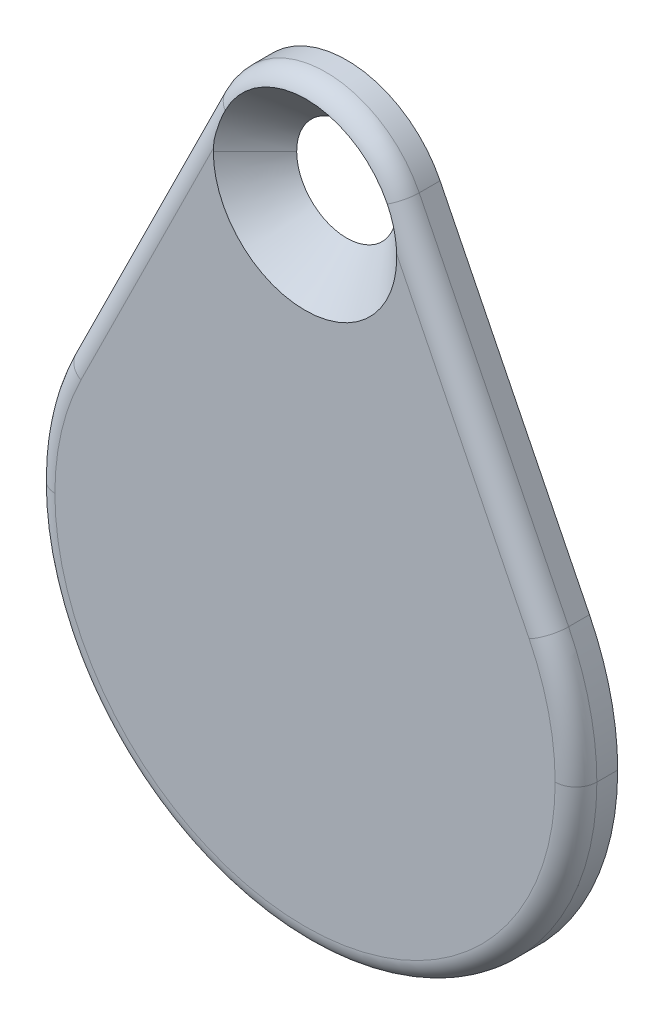
ISO-10303-21;
HEADER;
FILE_DESCRIPTION(('STEP AP214'),'2;1');
FILE_NAME('part.step','',(''),(''),'','','');
FILE_SCHEMA(('AUTOMOTIVE_DESIGN { 1 0 10303 214 1 1 1 1 }'));
ENDSEC;
DATA;
#1=APPLICATION_CONTEXT('core data for automotive mechanical design processes');
#2=APPLICATION_PROTOCOL_DEFINITION('international standard','automotive_design',2000,#1);
#3=PRODUCT_CONTEXT('',#1,'mechanical');
#4=PRODUCT('Part','Part','',(#3));
#5=PRODUCT_RELATED_PRODUCT_CATEGORY('part','',(#4));
#6=PRODUCT_DEFINITION_FORMATION('','',#4);
#7=PRODUCT_DEFINITION_CONTEXT('part definition',#1,'design');
#8=PRODUCT_DEFINITION('design','',#6,#7);
#9=PRODUCT_DEFINITION_SHAPE('','',#8);
#10=(LENGTH_UNIT() NAMED_UNIT(*) SI_UNIT(.MILLI.,.METRE.));
#11=(NAMED_UNIT(*) PLANE_ANGLE_UNIT() SI_UNIT($,.RADIAN.));
#12=(NAMED_UNIT(*) SI_UNIT($,.STERADIAN.) SOLID_ANGLE_UNIT());
#13=UNCERTAINTY_MEASURE_WITH_UNIT(LENGTH_MEASURE(1.E-05),#10,'distance_accuracy_value','');
#14=(GEOMETRIC_REPRESENTATION_CONTEXT(3) GLOBAL_UNCERTAINTY_ASSIGNED_CONTEXT((#13)) GLOBAL_UNIT_ASSIGNED_CONTEXT((#10,
#11,#12)) REPRESENTATION_CONTEXT('',''));
#15=CARTESIAN_POINT('',(0.,0.,0.));
#16=DIRECTION('',(0.,0.,1.));
#17=DIRECTION('',(1.,0.,0.));
#18=AXIS2_PLACEMENT_3D('',#15,#16,#17);
#19=CARTESIAN_POINT('',(0.,9.,1.));
#20=DIRECTION('',(0.,0.,1.));
#21=DIRECTION('',(1.,0.,0.));
#22=AXIS2_PLACEMENT_3D('',#19,#20,#21);
#23=CONICAL_SURFACE('',#22,2.2,0.785398163397448);
#24=CARTESIAN_POINT('',(0.,9.,0.));
#25=DIRECTION('',(0.,0.,1.));
#26=DIRECTION('',(1.,0.,0.));
#27=AXIS2_PLACEMENT_3D('',#24,#25,#26);
#28=CIRCLE('',#27,1.2);
#29=CARTESIAN_POINT('',(-1.2,9.,0.));
#30=VERTEX_POINT('',#29);
#31=CARTESIAN_POINT('',(1.2,9.,0.));
#32=VERTEX_POINT('',#31);
#33=EDGE_CURVE('E39',#30,#32,#28,.T.);
#34=ORIENTED_EDGE('',*,*,#33,.F.);
#35=DIRECTION('',(-0.707106781186547,0.,0.707106781186548));
#36=VECTOR('',#35,1.);
#37=CARTESIAN_POINT('',(-2.2,9.,1.));
#38=LINE('',#37,#36);
#39=CARTESIAN_POINT('',(-2.2,9.,1.));
#40=VERTEX_POINT('',#39);
#41=EDGE_CURVE('E11',#30,#40,#38,.T.);
#42=ORIENTED_EDGE('',*,*,#41,.T.);
#43=CARTESIAN_POINT('',(0.,9.,1.));
#44=DIRECTION('',(0.,0.,1.));
#45=DIRECTION('',(1.,0.,0.));
#46=AXIS2_PLACEMENT_3D('',#43,#44,#45);
#47=CIRCLE('',#46,2.2);
#48=CARTESIAN_POINT('',(2.2,9.,1.));
#49=VERTEX_POINT('',#48);
#50=EDGE_CURVE('E26',#40,#49,#47,.T.);
#51=ORIENTED_EDGE('',*,*,#50,.T.);
#52=DIRECTION('',(0.707106781186547,0.,0.707106781186548));
#53=VECTOR('',#52,1.);
#54=CARTESIAN_POINT('',(2.2,9.,1.));
#55=LINE('',#54,#53);
#56=EDGE_CURVE('E156',#32,#49,#55,.T.);
#57=ORIENTED_EDGE('',*,*,#56,.F.);
#58=EDGE_LOOP('',(#34,#42,#51,#57));
#59=FACE_BOUND('',#58,.T.);
#60=ADVANCED_FACE('F16',(#59),#23,.F.);
#61=CARTESIAN_POINT('',(0.,0.,0.5));
#62=DIRECTION('',(0.,0.,1.));
#63=DIRECTION('',(1.,0.,0.));
#64=AXIS2_PLACEMENT_3D('',#61,#62,#63);
#65=TOROIDAL_SURFACE('',#64,6.,0.5);
#66=CARTESIAN_POINT('',(0.,0.,0.5));
#67=DIRECTION('',(0.,0.,-1.));
#68=DIRECTION('',(1.,0.,0.));
#69=AXIS2_PLACEMENT_3D('',#66,#67,#68);
#70=CIRCLE('',#69,6.5);
#71=CARTESIAN_POINT('',(-6.5,0.,0.5));
#72=VERTEX_POINT('',#71);
#73=CARTESIAN_POINT('',(-5.82274170710451,2.88888888888889,0.5));
#74=VERTEX_POINT('',#73);
#75=EDGE_CURVE('E271',#72,#74,#70,.T.);
#76=ORIENTED_EDGE('',*,*,#75,.F.);
#77=CARTESIAN_POINT('',(-6.,0.,0.5));
#78=DIRECTION('',(0.,1.,0.));
#79=DIRECTION('',(-1.,0.,0.));
#80=AXIS2_PLACEMENT_3D('',#77,#78,#79);
#81=CIRCLE('',#80,0.5);
#82=CARTESIAN_POINT('',(-6.,0.,1.));
#83=VERTEX_POINT('',#82);
#84=EDGE_CURVE('E257',#72,#83,#81,.T.);
#85=ORIENTED_EDGE('',*,*,#84,.T.);
#86=CARTESIAN_POINT('',(0.,0.,1.));
#87=DIRECTION('',(0.,0.,1.));
#88=DIRECTION('',(1.,0.,0.));
#89=AXIS2_PLACEMENT_3D('',#86,#87,#88);
#90=CIRCLE('',#89,6.);
#91=CARTESIAN_POINT('',(-5.3748384988657,2.66666666666666,1.));
#92=VERTEX_POINT('',#91);
#93=EDGE_CURVE('E234',#92,#83,#90,.T.);
#94=ORIENTED_EDGE('',*,*,#93,.F.);
#95=CARTESIAN_POINT('',(-5.3748384988657,2.66666666666666,0.5));
#96=DIRECTION('',(-0.444444444444444,-0.895806416477617,0.));
#97=DIRECTION('',(0.895806416477617,-0.444444444444444,0.));
#98=AXIS2_PLACEMENT_3D('',#95,#96,#97);
#99=CIRCLE('',#98,0.5);
#100=EDGE_CURVE('E259',#92,#74,#99,.T.);
#101=ORIENTED_EDGE('',*,*,#100,.T.);
#102=EDGE_LOOP('',(#76,#85,#94,#101));
#103=FACE_BOUND('',#102,.T.);
#104=ADVANCED_FACE('F419',(#103),#65,.T.);
#105=CARTESIAN_POINT('',(0.,0.,0.5));
#106=DIRECTION('',(0.,0.,1.));
#107=DIRECTION('',(1.,0.,0.));
#108=AXIS2_PLACEMENT_3D('',#105,#106,#107);
#109=TOROIDAL_SURFACE('',#108,6.,0.5);
#110=ORIENTED_EDGE('',*,*,#84,.F.);
#111=CARTESIAN_POINT('',(0.,0.,0.5));
#112=DIRECTION('',(0.,0.,-1.));
#113=DIRECTION('',(1.,0.,0.));
#114=AXIS2_PLACEMENT_3D('',#111,#112,#113);
#115=CIRCLE('',#114,6.5);
#116=CARTESIAN_POINT('',(6.5,0.,0.5));
#117=VERTEX_POINT('',#116);
#118=EDGE_CURVE('E287',#117,#72,#115,.T.);
#119=ORIENTED_EDGE('',*,*,#118,.F.);
#120=CARTESIAN_POINT('',(6.,0.,0.5));
#121=DIRECTION('',(0.,-1.,0.));
#122=DIRECTION('',(0.,0.,-1.));
#123=AXIS2_PLACEMENT_3D('',#120,#121,#122);
#124=CIRCLE('',#123,0.5);
#125=CARTESIAN_POINT('',(6.,0.,1.));
#126=VERTEX_POINT('',#125);
#127=EDGE_CURVE('E262',#117,#126,#124,.T.);
#128=ORIENTED_EDGE('',*,*,#127,.T.);
#129=CARTESIAN_POINT('',(0.,0.,1.));
#130=DIRECTION('',(0.,0.,1.));
#131=DIRECTION('',(1.,0.,0.));
#132=AXIS2_PLACEMENT_3D('',#129,#130,#131);
#133=CIRCLE('',#132,6.);
#134=EDGE_CURVE('E245',#83,#126,#133,.T.);
#135=ORIENTED_EDGE('',*,*,#134,.F.);
#136=EDGE_LOOP('',(#110,#119,#128,#135));
#137=FACE_BOUND('',#136,.T.);
#138=ADVANCED_FACE('F423',(#137),#109,.T.);
#139=CARTESIAN_POINT('',(0.,0.,0.5));
#140=DIRECTION('',(0.,0.,-1.));
#141=DIRECTION('',(-1.,0.,0.));
#142=AXIS2_PLACEMENT_3D('',#139,#140,#141);
#143=CYLINDRICAL_SURFACE('',#142,3.5);
#144=CARTESIAN_POINT('',(0.,0.,0.5));
#145=DIRECTION('',(0.,0.,-1.));
#146=DIRECTION('',(-1.,0.,0.));
#147=AXIS2_PLACEMENT_3D('',#144,#145,#146);
#148=CIRCLE('',#147,3.5);
#149=CARTESIAN_POINT('',(3.5,0.,0.5));
#150=VERTEX_POINT('',#149);
#151=CARTESIAN_POINT('',(-3.5,0.,0.5));
#152=VERTEX_POINT('',#151);
#153=EDGE_CURVE('E221',#150,#152,#148,.T.);
#154=ORIENTED_EDGE('',*,*,#153,.F.);
#155=DIRECTION('',(0.,0.,-1.));
#156=VECTOR('',#155,1.);
#157=CARTESIAN_POINT('',(3.5,0.,0.5));
#158=LINE('',#157,#156);
#159=CARTESIAN_POINT('',(3.5,0.,0.));
#160=VERTEX_POINT('',#159);
#161=EDGE_CURVE('E348',#150,#160,#158,.T.);
#162=ORIENTED_EDGE('',*,*,#161,.T.);
#163=CARTESIAN_POINT('',(0.,0.,0.));
#164=DIRECTION('',(0.,0.,-1.));
#165=DIRECTION('',(-1.,0.,0.));
#166=AXIS2_PLACEMENT_3D('',#163,#164,#165);
#167=CIRCLE('',#166,3.5);
#168=CARTESIAN_POINT('',(-3.5,0.,0.));
#169=VERTEX_POINT('',#168);
#170=EDGE_CURVE('E343',#160,#169,#167,.T.);
#171=ORIENTED_EDGE('',*,*,#170,.T.);
#172=DIRECTION('',(0.,0.,-1.));
#173=VECTOR('',#172,1.);
#174=CARTESIAN_POINT('',(-3.5,0.,0.5));
#175=LINE('',#174,#173);
#176=EDGE_CURVE('E289',#152,#169,#175,.T.);
#177=ORIENTED_EDGE('',*,*,#176,.F.);
#178=EDGE_LOOP('',(#154,#162,#171,#177));
#179=FACE_BOUND('',#178,.T.);
#180=ADVANCED_FACE('F398',(#179),#143,.F.);
#181=CARTESIAN_POINT('',(0.,0.,1.));
#182=DIRECTION('',(0.,0.,-1.));
#183=DIRECTION('',(-1.,0.,0.));
#184=AXIS2_PLACEMENT_3D('',#181,#182,#183);
#185=CYLINDRICAL_SURFACE('',#184,6.5);
#186=CARTESIAN_POINT('',(0.,0.,0.5));
#187=DIRECTION('',(0.,0.,-1.));
#188=DIRECTION('',(1.,0.,0.));
#189=AXIS2_PLACEMENT_3D('',#186,#187,#188);
#190=CIRCLE('',#189,6.5);
#191=CARTESIAN_POINT('',(5.82274170710451,2.88888888888889,0.5));
#192=VERTEX_POINT('',#191);
#193=EDGE_CURVE('E339',#192,#117,#190,.T.);
#194=ORIENTED_EDGE('',*,*,#193,.T.);
#195=DIRECTION('',(0.,0.,-1.));
#196=VECTOR('',#195,1.);
#197=CARTESIAN_POINT('',(6.5,0.,1.));
#198=LINE('',#197,#196);
#199=CARTESIAN_POINT('',(6.5,0.,0.));
#200=VERTEX_POINT('',#199);
#201=EDGE_CURVE('E286',#117,#200,#198,.T.);
#202=ORIENTED_EDGE('',*,*,#201,.T.);
#203=CARTESIAN_POINT('',(0.,0.,0.));
#204=DIRECTION('',(0.,0.,1.));
#205=DIRECTION('',(1.,0.,0.));
#206=AXIS2_PLACEMENT_3D('',#203,#204,#205);
#207=CIRCLE('',#206,6.5);
#208=CARTESIAN_POINT('',(5.82274170710451,2.88888888888889,0.));
#209=VERTEX_POINT('',#208);
#210=EDGE_CURVE('E283',#200,#209,#207,.T.);
#211=ORIENTED_EDGE('',*,*,#210,.T.);
#212=DIRECTION('',(0.,0.,-1.));
#213=VECTOR('',#212,1.);
#214=CARTESIAN_POINT('',(5.82274170710451,2.88888888888889,1.));
#215=LINE('',#214,#213);
#216=EDGE_CURVE('E242',#192,#209,#215,.T.);
#217=ORIENTED_EDGE('',*,*,#216,.F.);
#218=EDGE_LOOP('',(#194,#202,#211,#217));
#219=FACE_BOUND('',#218,.T.);
#220=ADVANCED_FACE('F573',(#219),#185,.T.);
#221=CARTESIAN_POINT('',(0.,0.,1.));
#222=DIRECTION('',(0.,0.,-1.));
#223=DIRECTION('',(-1.,0.,0.));
#224=AXIS2_PLACEMENT_3D('',#221,#222,#223);
#225=CYLINDRICAL_SURFACE('',#224,6.5);
#226=ORIENTED_EDGE('',*,*,#201,.F.);
#227=ORIENTED_EDGE('',*,*,#118,.T.);
#228=DIRECTION('',(0.,0.,-1.));
#229=VECTOR('',#228,1.);
#230=CARTESIAN_POINT('',(-6.5,0.,1.));
#231=LINE('',#230,#229);
#232=CARTESIAN_POINT('',(-6.5,0.,0.));
#233=VERTEX_POINT('',#232);
#234=EDGE_CURVE('E314',#72,#233,#231,.T.);
#235=ORIENTED_EDGE('',*,*,#234,.T.);
#236=CARTESIAN_POINT('',(0.,0.,0.));
#237=DIRECTION('',(0.,0.,1.));
#238=DIRECTION('',(1.,0.,0.));
#239=AXIS2_PLACEMENT_3D('',#236,#237,#238);
#240=CIRCLE('',#239,6.5);
#241=EDGE_CURVE('E69',#233,#200,#240,.T.);
#242=ORIENTED_EDGE('',*,*,#241,.T.);
#243=EDGE_LOOP('',(#226,#227,#235,#242));
#244=FACE_BOUND('',#243,.T.);
#245=ADVANCED_FACE('F434',(#244),#225,.T.);
#246=CARTESIAN_POINT('',(0.,9.,1.));
#247=DIRECTION('',(0.,0.,-1.));
#248=DIRECTION('',(-1.,0.,0.));
#249=AXIS2_PLACEMENT_3D('',#246,#247,#248);
#250=CYLINDRICAL_SURFACE('',#249,2.5);
#251=DIRECTION('',(0.,0.,-1.));
#252=VECTOR('',#251,1.);
#253=CARTESIAN_POINT('',(-2.23951604119404,10.1111111111111,1.));
#254=LINE('',#253,#252);
#255=CARTESIAN_POINT('',(-2.23951604119404,10.1111111111111,0.5));
#256=VERTEX_POINT('',#255);
#257=CARTESIAN_POINT('',(-2.23951604119404,10.1111111111111,0.));
#258=VERTEX_POINT('',#257);
#259=EDGE_CURVE('E87',#256,#258,#254,.T.);
#260=ORIENTED_EDGE('',*,*,#259,.F.);
#261=CARTESIAN_POINT('',(0.,9.,0.5));
#262=DIRECTION('',(0.,0.,-1.));
#263=DIRECTION('',(1.,0.,0.));
#264=AXIS2_PLACEMENT_3D('',#261,#262,#263);
#265=CIRCLE('',#264,2.5);
#266=CARTESIAN_POINT('',(2.23951604119404,10.1111111111111,0.5));
#267=VERTEX_POINT('',#266);
#268=EDGE_CURVE('E280',#256,#267,#265,.T.);
#269=ORIENTED_EDGE('',*,*,#268,.T.);
#270=DIRECTION('',(0.,0.,-1.));
#271=VECTOR('',#270,1.);
#272=CARTESIAN_POINT('',(2.23951604119404,10.1111111111111,1.));
#273=LINE('',#272,#271);
#274=CARTESIAN_POINT('',(2.23951604119404,10.1111111111111,0.));
#275=VERTEX_POINT('',#274);
#276=EDGE_CURVE('E267',#267,#275,#273,.T.);
#277=ORIENTED_EDGE('',*,*,#276,.T.);
#278=CARTESIAN_POINT('',(0.,9.,0.));
#279=DIRECTION('',(0.,0.,1.));
#280=DIRECTION('',(1.,0.,0.));
#281=AXIS2_PLACEMENT_3D('',#278,#279,#280);
#282=CIRCLE('',#281,2.5);
#283=EDGE_CURVE('E264',#275,#258,#282,.T.);
#284=ORIENTED_EDGE('',*,*,#283,.T.);
#285=EDGE_LOOP('',(#260,#269,#277,#284));
#286=FACE_BOUND('',#285,.T.);
#287=ADVANCED_FACE('F374',(#286),#250,.T.);
#288=CARTESIAN_POINT('',(-2.23951604119404,10.1111111111111,1.));
#289=DIRECTION('',(0.895806416477617,-0.444444444444444,0.));
#290=DIRECTION('',(0.,0.,-1.));
#291=AXIS2_PLACEMENT_3D('',#288,#289,#290);
#292=PLANE('',#291);
#293=DIRECTION('',(0.,0.,-1.));
#294=VECTOR('',#293,1.);
#295=CARTESIAN_POINT('',(-5.82274170710451,2.88888888888889,1.));
#296=LINE('',#295,#294);
#297=CARTESIAN_POINT('',(-5.82274170710451,2.88888888888889,0.));
#298=VERTEX_POINT('',#297);
#299=EDGE_CURVE('E276',#74,#298,#296,.T.);
#300=ORIENTED_EDGE('',*,*,#299,.F.);
#301=DIRECTION('',(0.444444444444444,0.895806416477617,0.));
#302=VECTOR('',#301,1.);
#303=CARTESIAN_POINT('',(-2.23951604119404,10.1111111111111,0.5));
#304=LINE('',#303,#302);
#305=EDGE_CURVE('E268',#74,#256,#304,.T.);
#306=ORIENTED_EDGE('',*,*,#305,.T.);
#307=ORIENTED_EDGE('',*,*,#259,.T.);
#308=DIRECTION('',(-0.444444444444444,-0.895806416477617,0.));
#309=VECTOR('',#308,1.);
#310=CARTESIAN_POINT('',(-2.23951604119404,10.1111111111111,0.));
#311=LINE('',#310,#309);
#312=EDGE_CURVE('E275',#258,#298,#311,.T.);
#313=ORIENTED_EDGE('',*,*,#312,.T.);
#314=EDGE_LOOP('',(#300,#306,#307,#313));
#315=FACE_BOUND('',#314,.T.);
#316=ADVANCED_FACE('F371',(#315),#292,.F.);
#317=CARTESIAN_POINT('',(0.,0.,1.));
#318=DIRECTION('',(0.,0.,-1.));
#319=DIRECTION('',(-1.,0.,0.));
#320=AXIS2_PLACEMENT_3D('',#317,#318,#319);
#321=CYLINDRICAL_SURFACE('',#320,6.5);
#322=ORIENTED_EDGE('',*,*,#234,.F.);
#323=ORIENTED_EDGE('',*,*,#75,.T.);
#324=ORIENTED_EDGE('',*,*,#299,.T.);
#325=CARTESIAN_POINT('',(0.,0.,0.));
#326=DIRECTION('',(0.,0.,1.));
#327=DIRECTION('',(1.,0.,0.));
#328=AXIS2_PLACEMENT_3D('',#325,#326,#327);
#329=CIRCLE('',#328,6.5);
#330=EDGE_CURVE('E306',#298,#233,#329,.T.);
#331=ORIENTED_EDGE('',*,*,#330,.T.);
#332=EDGE_LOOP('',(#322,#323,#324,#331));
#333=FACE_BOUND('',#332,.T.);
#334=ADVANCED_FACE('F197',(#333),#321,.T.);
#335=CARTESIAN_POINT('',(2.23951604119404,10.1111111111111,1.));
#336=DIRECTION('',(-0.895806416477617,-0.444444444444444,0.));
#337=DIRECTION('',(-0.444444444444444,0.895806416477617,0.));
#338=AXIS2_PLACEMENT_3D('',#335,#336,#337);
#339=PLANE('',#338);
#340=ORIENTED_EDGE('',*,*,#276,.F.);
#341=DIRECTION('',(0.444444444444444,-0.895806416477617,0.));
#342=VECTOR('',#341,1.);
#343=CARTESIAN_POINT('',(5.82274170710451,2.88888888888889,0.5));
#344=LINE('',#343,#342);
#345=EDGE_CURVE('E302',#267,#192,#344,.T.);
#346=ORIENTED_EDGE('',*,*,#345,.T.);
#347=ORIENTED_EDGE('',*,*,#216,.T.);
#348=DIRECTION('',(-0.444444444444444,0.895806416477617,0.));
#349=VECTOR('',#348,1.);
#350=CARTESIAN_POINT('',(2.23951604119404,10.1111111111111,0.));
#351=LINE('',#350,#349);
#352=EDGE_CURVE('E233',#209,#275,#351,.T.);
#353=ORIENTED_EDGE('',*,*,#352,.T.);
#354=EDGE_LOOP('',(#340,#346,#347,#353));
#355=FACE_BOUND('',#354,.T.);
#356=ADVANCED_FACE('F414',(#355),#339,.F.);
#357=CARTESIAN_POINT('',(0.,9.,1.));
#358=DIRECTION('',(0.,0.,1.));
#359=DIRECTION('',(1.,0.,0.));
#360=AXIS2_PLACEMENT_3D('',#357,#358,#359);
#361=PLANE('',#360);
#362=CARTESIAN_POINT('',(0.,9.,1.));
#363=DIRECTION('',(0.,0.,1.));
#364=DIRECTION('',(1.,0.,0.));
#365=AXIS2_PLACEMENT_3D('',#362,#363,#364);
#366=CIRCLE('',#365,2.2);
#367=CARTESIAN_POINT('',(-2.19895289472909,9.06786874658172,1.));
#368=VERTEX_POINT('',#367);
#369=EDGE_CURVE('E224',#368,#40,#366,.T.);
#370=ORIENTED_EDGE('',*,*,#369,.F.);
#371=DIRECTION('',(-0.444444444444444,-0.895806416477617,0.));
#372=VECTOR('',#371,1.);
#373=CARTESIAN_POINT('',(-5.3748384988657,2.66666666666666,1.));
#374=LINE('',#373,#372);
#375=EDGE_CURVE('E230',#368,#92,#374,.T.);
#376=ORIENTED_EDGE('',*,*,#375,.T.);
#377=ORIENTED_EDGE('',*,*,#93,.T.);
#378=ORIENTED_EDGE('',*,*,#134,.T.);
#379=CARTESIAN_POINT('',(0.,0.,1.));
#380=DIRECTION('',(0.,0.,1.));
#381=DIRECTION('',(1.,0.,0.));
#382=AXIS2_PLACEMENT_3D('',#379,#380,#381);
#383=CIRCLE('',#382,6.);
#384=CARTESIAN_POINT('',(5.3748384988657,2.66666666666667,1.));
#385=VERTEX_POINT('',#384);
#386=EDGE_CURVE('E163',#126,#385,#383,.T.);
#387=ORIENTED_EDGE('',*,*,#386,.T.);
#388=DIRECTION('',(-0.444444444444444,0.895806416477617,0.));
#389=VECTOR('',#388,1.);
#390=CARTESIAN_POINT('',(1.79161283295524,9.88888888888889,1.));
#391=LINE('',#390,#389);
#392=CARTESIAN_POINT('',(2.19895289472909,9.06786874658172,1.));
#393=VERTEX_POINT('',#392);
#394=EDGE_CURVE('E160',#385,#393,#391,.T.);
#395=ORIENTED_EDGE('',*,*,#394,.T.);
#396=CARTESIAN_POINT('',(0.,9.,1.));
#397=DIRECTION('',(0.,0.,1.));
#398=DIRECTION('',(1.,0.,0.));
#399=AXIS2_PLACEMENT_3D('',#396,#397,#398);
#400=CIRCLE('',#399,2.2);
#401=EDGE_CURVE('E149',#49,#393,#400,.T.);
#402=ORIENTED_EDGE('',*,*,#401,.F.);
#403=ORIENTED_EDGE('',*,*,#50,.F.);
#404=EDGE_LOOP('',(#370,#376,#377,#378,#387,#395,#402,#403));
#405=FACE_BOUND('',#404,.T.);
#406=ADVANCED_FACE('F161',(#405),#361,.T.);
#407=CARTESIAN_POINT('',(0.,9.,0.));
#408=DIRECTION('',(0.,0.,1.));
#409=DIRECTION('',(1.,0.,0.));
#410=AXIS2_PLACEMENT_3D('',#407,#408,#409);
#411=PLANE('',#410);
#412=ORIENTED_EDGE('',*,*,#283,.F.);
#413=ORIENTED_EDGE('',*,*,#352,.F.);
#414=ORIENTED_EDGE('',*,*,#210,.F.);
#415=ORIENTED_EDGE('',*,*,#241,.F.);
#416=ORIENTED_EDGE('',*,*,#330,.F.);
#417=ORIENTED_EDGE('',*,*,#312,.F.);
#418=EDGE_LOOP('',(#412,#413,#414,#415,#416,#417));
#419=FACE_BOUND('',#418,.T.);
#420=CARTESIAN_POINT('',(0.,9.,0.));
#421=DIRECTION('',(0.,0.,1.));
#422=DIRECTION('',(1.,0.,0.));
#423=AXIS2_PLACEMENT_3D('',#420,#421,#422);
#424=CIRCLE('',#423,1.2);
#425=EDGE_CURVE('E168',#32,#30,#424,.T.);
#426=ORIENTED_EDGE('',*,*,#425,.T.);
#427=ORIENTED_EDGE('',*,*,#33,.T.);
#428=EDGE_LOOP('',(#426,#427));
#429=FACE_BOUND('',#428,.T.);
#430=CARTESIAN_POINT('',(0.,0.,0.));
#431=DIRECTION('',(0.,0.,-1.));
#432=DIRECTION('',(-1.,0.,0.));
#433=AXIS2_PLACEMENT_3D('',#430,#431,#432);
#434=CIRCLE('',#433,3.5);
#435=EDGE_CURVE('E292',#169,#160,#434,.T.);
#436=ORIENTED_EDGE('',*,*,#435,.F.);
#437=ORIENTED_EDGE('',*,*,#170,.F.);
#438=EDGE_LOOP('',(#436,#437));
#439=FACE_BOUND('',#438,.T.);
#440=ADVANCED_FACE('F377',(#419,#429,#439),#411,.F.);
#441=CARTESIAN_POINT('',(0.,0.,0.5));
#442=DIRECTION('',(0.,0.,-1.));
#443=DIRECTION('',(-1.,0.,0.));
#444=AXIS2_PLACEMENT_3D('',#441,#442,#443);
#445=CYLINDRICAL_SURFACE('',#444,3.5);
#446=ORIENTED_EDGE('',*,*,#161,.F.);
#447=CARTESIAN_POINT('',(0.,0.,0.5));
#448=DIRECTION('',(0.,0.,-1.));
#449=DIRECTION('',(-1.,0.,0.));
#450=AXIS2_PLACEMENT_3D('',#447,#448,#449);
#451=CIRCLE('',#450,3.5);
#452=EDGE_CURVE('E296',#152,#150,#451,.T.);
#453=ORIENTED_EDGE('',*,*,#452,.F.);
#454=ORIENTED_EDGE('',*,*,#176,.T.);
#455=ORIENTED_EDGE('',*,*,#435,.T.);
#456=EDGE_LOOP('',(#446,#453,#454,#455));
#457=FACE_BOUND('',#456,.T.);
#458=ADVANCED_FACE('F18',(#457),#445,.F.);
#459=CARTESIAN_POINT('',(0.,0.,0.5));
#460=DIRECTION('',(0.,0.,-1.));
#461=DIRECTION('',(0.,-1.,0.));
#462=AXIS2_PLACEMENT_3D('',#459,#460,#461);
#463=PLANE('',#462);
#464=ORIENTED_EDGE('',*,*,#452,.T.);
#465=ORIENTED_EDGE('',*,*,#153,.T.);
#466=EDGE_LOOP('',(#464,#465));
#467=FACE_BOUND('',#466,.T.);
#468=ADVANCED_FACE('F413',(#467),#463,.T.);
#469=CARTESIAN_POINT('',(0.,9.,0.5));
#470=DIRECTION('',(0.,0.,1.));
#471=DIRECTION('',(1.,0.,0.));
#472=AXIS2_PLACEMENT_3D('',#469,#470,#471);
#473=TOROIDAL_SURFACE('',#472,2.,0.5);
#474=CARTESIAN_POINT('',(0.,9.,0.970156211871642));
#475=DIRECTION('',(0.,0.,1.));
#476=DIRECTION('',(-1.,0.,0.));
#477=AXIS2_PLACEMENT_3D('',#474,#475,#476);
#478=CIRCLE('',#477,2.17015621187164);
#479=CARTESIAN_POINT('',(1.94403985935338,9.96451387194295,0.970156211871642));
#480=VERTEX_POINT('',#479);
#481=CARTESIAN_POINT('',(-1.9440398593534,9.96451387194296,0.970156211871635));
#482=VERTEX_POINT('',#481);
#483=EDGE_CURVE('E176',#480,#482,#478,.T.);
#484=ORIENTED_EDGE('',*,*,#483,.F.);
#485=CARTESIAN_POINT('',(1.79161283295524,9.88888888888889,0.5));
#486=DIRECTION('',(0.444444444444445,-0.895806416477616,0.));
#487=DIRECTION('',(0.895806416477617,0.444444444444445,0.));
#488=AXIS2_PLACEMENT_3D('',#485,#486,#487);
#489=CIRCLE('',#488,0.5);
#490=EDGE_CURVE('E174',#267,#480,#489,.T.);
#491=ORIENTED_EDGE('',*,*,#490,.F.);
#492=ORIENTED_EDGE('',*,*,#268,.F.);
#493=CARTESIAN_POINT('',(-1.79161283295524,9.88888888888889,0.5));
#494=DIRECTION('',(-0.444444444444445,-0.895806416477616,0.));
#495=DIRECTION('',(0.895806416477616,-0.444444444444445,0.));
#496=AXIS2_PLACEMENT_3D('',#493,#494,#495);
#497=CIRCLE('',#496,0.5);
#498=EDGE_CURVE('E212',#482,#256,#497,.T.);
#499=ORIENTED_EDGE('',*,*,#498,.F.);
#500=EDGE_LOOP('',(#484,#491,#492,#499));
#501=FACE_BOUND('',#500,.T.);
#502=ADVANCED_FACE('F202',(#501),#473,.T.);
#503=CARTESIAN_POINT('',(-1.79161283295523,9.88888888888889,0.5));
#504=DIRECTION('',(0.444444444444445,0.895806416477616,0.));
#505=DIRECTION('',(-0.895806416477617,0.444444444444445,0.));
#506=AXIS2_PLACEMENT_3D('',#503,#504,#505);
#507=CYLINDRICAL_SURFACE('',#506,0.5);
#508=CARTESIAN_POINT('',(-1.94403985935338,9.96451387194296,0.970156211871648));
#509=CARTESIAN_POINT('',(-1.95441444799561,9.94360568888863,0.970157159870851));
#510=CARTESIAN_POINT('',(-1.96455491425017,9.92258086175922,0.970273389234268));
#511=CARTESIAN_POINT('',(-1.98478200355335,9.8793548797709,0.970721131731491));
#512=CARTESIAN_POINT('',(-1.99484590626972,9.85714319066114,0.971062046895202));
#513=CARTESIAN_POINT('',(-2.01482308402011,9.8115041259208,0.971958579250977));
#514=CARTESIAN_POINT('',(-2.02471093398818,9.78806577922204,0.97252286005161));
#515=CARTESIAN_POINT('',(-2.04423458791121,9.73993825669008,0.97386792460362));
#516=CARTESIAN_POINT('',(-2.05384233139716,9.71523791275894,0.974656811141686));
#517=CARTESIAN_POINT('',(-2.0726928284297,9.66455325610535,0.976448212472146));
#518=CARTESIAN_POINT('',(-2.08190465938549,9.63855769857634,0.977458134963104));
#519=CARTESIAN_POINT('',(-2.09985895295885,9.58525978212084,0.979705499299526));
#520=CARTESIAN_POINT('',(-2.10856822451404,9.55794653879461,0.980950386651884));
#521=CARTESIAN_POINT('',(-2.12429404396873,9.50547384243039,0.983448706191169));
#522=CARTESIAN_POINT('',(-2.13139222464824,9.48033842416353,0.984691570401056));
#523=CARTESIAN_POINT('',(-2.14472156531046,9.42978850123014,0.987205061872258));
#524=CARTESIAN_POINT('',(-2.15095102204922,9.40437355085109,0.988475738175382));
#525=CARTESIAN_POINT('',(-2.16263220559455,9.35331771767065,0.99114711268236));
#526=CARTESIAN_POINT('',(-2.1680823376016,9.32767648243981,0.992548068091471));
#527=CARTESIAN_POINT('',(-2.17784535831073,9.2762479244807,0.995140642192652));
#528=CARTESIAN_POINT('',(-2.18216193674542,9.25046136198127,0.996332935745719));
#529=CARTESIAN_POINT('',(-2.18936287800358,9.19862634158954,0.998198776668654));
#530=CARTESIAN_POINT('',(-2.19224493373884,9.17257753012115,0.998871489368765));
#531=CARTESIAN_POINT('',(-2.19662614815427,9.12031359079589,0.999761772920742));
#532=CARTESIAN_POINT('',(-2.19812309896887,9.09409826424366,0.999978617813929));
#533=CARTESIAN_POINT('',(-2.19895289472909,9.06786874658172,1.));
#534=B_SPLINE_CURVE_WITH_KNOTS('',3,(#508,#509,#510,#511,#512,#513,#514,#515,#516,#517,#518,
#519,#520,#521,#522,#523,#524,#525,#526,#527,#528,#529,#530,#531,#532,#533),.UNSPECIFIED.,.F.,
.F.,(4,2,2,2,2,2,2,2,2,2,2,2,4),(0.,0.0700207868049487,0.143175290130226,0.21949982862027,
0.299032279110682,0.381812253267239,0.467881243428108,0.546310039607789,0.624890506222841,
0.703629545492976,0.782109018934827,0.860714303367118,0.939444670324029),.UNSPECIFIED.);
#535=EDGE_CURVE('E228',#482,#368,#534,.T.);
#536=ORIENTED_EDGE('',*,*,#535,.F.);
#537=ORIENTED_EDGE('',*,*,#498,.T.);
#538=ORIENTED_EDGE('',*,*,#305,.F.);
#539=ORIENTED_EDGE('',*,*,#100,.F.);
#540=ORIENTED_EDGE('',*,*,#375,.F.);
#541=EDGE_LOOP('',(#536,#537,#538,#539,#540));
#542=FACE_BOUND('',#541,.T.);
#543=ADVANCED_FACE('F196',(#542),#507,.T.);
#544=CARTESIAN_POINT('',(1.79161283295524,9.88888888888889,0.5));
#545=DIRECTION('',(0.444444444444445,-0.895806416477616,0.));
#546=DIRECTION('',(0.895806416477617,0.444444444444445,0.));
#547=AXIS2_PLACEMENT_3D('',#544,#545,#546);
#548=CYLINDRICAL_SURFACE('',#547,0.5);
#549=CARTESIAN_POINT('',(2.19895289472909,9.06786874658172,1.));
#550=CARTESIAN_POINT('',(2.198211091257,9.09136475377438,0.999982946827379));
#551=CARTESIAN_POINT('',(2.19687024996556,9.11483615807018,0.999743964810903));
#552=CARTESIAN_POINT('',(2.1928595359514,9.16432841857703,0.998852806678338));
#553=CARTESIAN_POINT('',(2.19005668360695,9.19033787041923,0.998157019100118));
#554=CARTESIAN_POINT('',(2.18283796463941,9.24479456193292,0.996332803224155));
#555=CARTESIAN_POINT('',(2.17828767884759,9.27322243554244,0.995167748981979));
#556=CARTESIAN_POINT('',(2.16834628668329,9.32725589589691,0.992746822108526));
#557=CARTESIAN_POINT('',(2.16306885357792,9.35288363331849,0.991508767015481));
#558=CARTESIAN_POINT('',(2.15157137857031,9.40388682288468,0.988995981763721));
#559=CARTESIAN_POINT('',(2.14535270429618,9.42926258505321,0.987721306956105));
#560=CARTESIAN_POINT('',(2.13190185130707,9.47969533102414,0.985047955865087));
#561=CARTESIAN_POINT('',(2.12467123227494,9.50475274186167,0.983649471602058));
#562=CARTESIAN_POINT('',(2.10964284700522,9.55384162227947,0.980985345484362));
#563=CARTESIAN_POINT('',(2.10186993401564,9.57788064586115,0.97971691495433));
#564=CARTESIAN_POINT('',(2.08566049846279,9.62604634265212,0.977444000292079));
#565=CARTESIAN_POINT('',(2.07721753107846,9.65017099364031,0.976442623966538));
#566=CARTESIAN_POINT('',(2.05959016709108,9.69847094384756,0.974650677621842));
#567=CARTESIAN_POINT('',(2.05039836420015,9.72264363832021,0.973862662783787));
#568=CARTESIAN_POINT('',(2.03125886858397,9.77102486929605,0.972511835991873));
#569=CARTESIAN_POINT('',(2.02130353213318,9.79523045886806,0.971951793006588));
#570=CARTESIAN_POINT('',(2.00060498545343,9.84365409699684,0.971052997727293));
#571=CARTESIAN_POINT('',(1.98985369062995,9.86786874304708,0.970717008861711));
#572=CARTESIAN_POINT('',(1.9675359205801,9.9162866500263,0.970267083097977));
#573=CARTESIAN_POINT('',(1.95596097978194,9.94048603486126,0.970155955698158));
#574=CARTESIAN_POINT('',(1.94403985935337,9.96451387194295,0.970156211871641));
#575=B_SPLINE_CURVE_WITH_KNOTS('',3,(#549,#550,#551,#552,#553,#554,#555,#556,#557,#558,#559,
#560,#561,#562,#563,#564,#565,#566,#567,#568,#569,#570,#571,#572,#573,#574),.UNSPECIFIED.,.F.,
.F.,(4,2,2,2,2,2,2,2,2,2,2,2,4),(0.,0.0705067501597377,0.148975284770991,0.235376385829013,
0.313942049926994,0.392394634578158,0.470727607436183,0.54660739303153,0.623335084163779,
0.700944643853255,0.779470585679284,0.85894796704987,0.939412383146379),.UNSPECIFIED.);
#576=EDGE_CURVE('E153',#393,#480,#575,.T.);
#577=ORIENTED_EDGE('',*,*,#576,.F.);
#578=ORIENTED_EDGE('',*,*,#394,.F.);
#579=CARTESIAN_POINT('',(5.3748384988657,2.66666666666667,0.5));
#580=DIRECTION('',(0.444444444444444,-0.895806416477617,0.));
#581=DIRECTION('',(0.895806416477617,0.444444444444444,0.));
#582=AXIS2_PLACEMENT_3D('',#579,#580,#581);
#583=CIRCLE('',#582,0.5);
#584=EDGE_CURVE('E277',#192,#385,#583,.T.);
#585=ORIENTED_EDGE('',*,*,#584,.F.);
#586=ORIENTED_EDGE('',*,*,#345,.F.);
#587=ORIENTED_EDGE('',*,*,#490,.T.);
#588=EDGE_LOOP('',(#577,#578,#585,#586,#587));
#589=FACE_BOUND('',#588,.T.);
#590=ADVANCED_FACE('F172',(#589),#548,.T.);
#591=CARTESIAN_POINT('',(0.,0.,0.5));
#592=DIRECTION('',(0.,0.,1.));
#593=DIRECTION('',(1.,0.,0.));
#594=AXIS2_PLACEMENT_3D('',#591,#592,#593);
#595=TOROIDAL_SURFACE('',#594,6.,0.5);
#596=ORIENTED_EDGE('',*,*,#127,.F.);
#597=ORIENTED_EDGE('',*,*,#193,.F.);
#598=ORIENTED_EDGE('',*,*,#584,.T.);
#599=ORIENTED_EDGE('',*,*,#386,.F.);
#600=EDGE_LOOP('',(#596,#597,#598,#599));
#601=FACE_BOUND('',#600,.T.);
#602=ADVANCED_FACE('F195',(#601),#595,.T.);
#603=CARTESIAN_POINT('',(0.,9.,1.));
#604=DIRECTION('',(0.,0.,1.));
#605=DIRECTION('',(1.,0.,0.));
#606=AXIS2_PLACEMENT_3D('',#603,#604,#605);
#607=CONICAL_SURFACE('',#606,2.2,0.785398163397448);
#608=ORIENTED_EDGE('',*,*,#41,.F.);
#609=ORIENTED_EDGE('',*,*,#425,.F.);
#610=ORIENTED_EDGE('',*,*,#56,.T.);
#611=ORIENTED_EDGE('',*,*,#401,.T.);
#612=ORIENTED_EDGE('',*,*,#576,.T.);
#613=ORIENTED_EDGE('',*,*,#483,.T.);
#614=ORIENTED_EDGE('',*,*,#535,.T.);
#615=ORIENTED_EDGE('',*,*,#369,.T.);
#616=EDGE_LOOP('',(#608,#609,#610,#611,#612,#613,#614,#615));
#617=FACE_BOUND('',#616,.T.);
#618=ADVANCED_FACE('F151',(#617),#607,.F.);
#619=CLOSED_SHELL('',(#60,#104,#138,#180,#220,#245,#287,#316,#334,#356,#406,#440,#458,#468,#502,
#543,#590,#602,#618));
#620=MANIFOLD_SOLID_BREP('B1',#619);
#621=ADVANCED_BREP_SHAPE_REPRESENTATION('',(#18,#620),#14);
#622=SHAPE_DEFINITION_REPRESENTATION(#9,#621);
ENDSEC;
END-ISO-10303-21;
